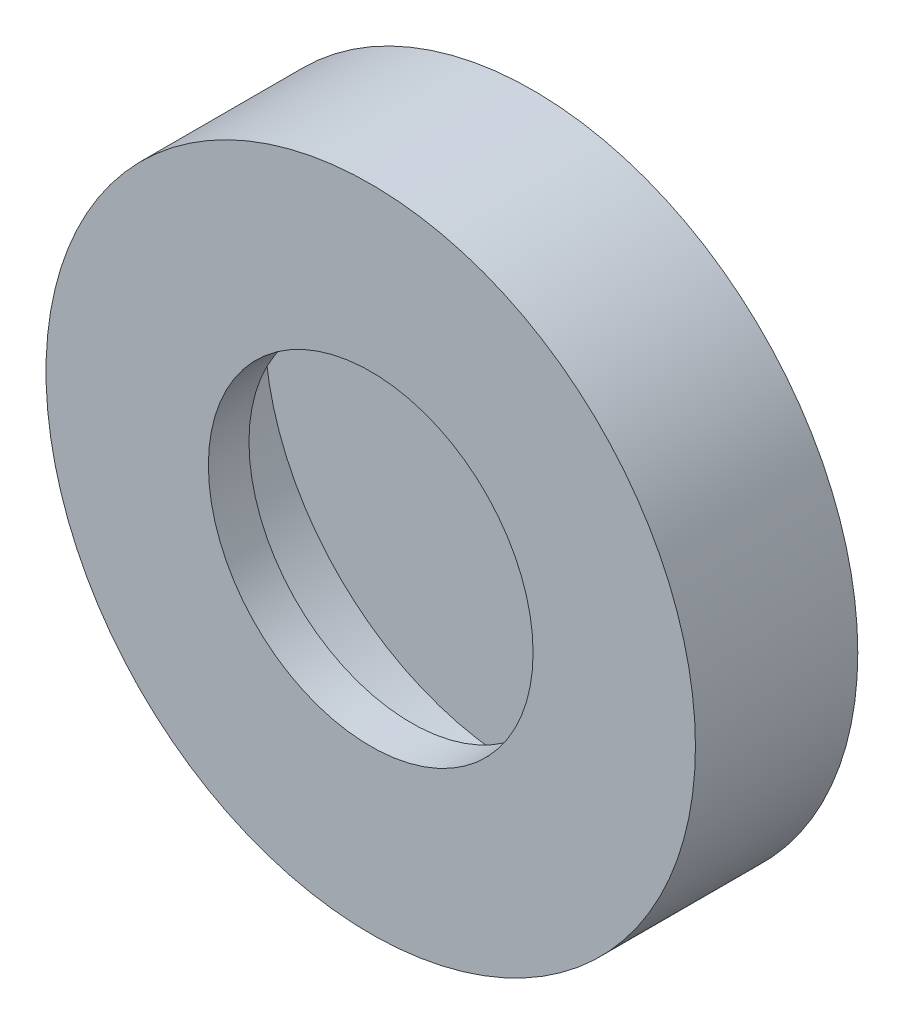
ISO-10303-21;
HEADER;
FILE_DESCRIPTION(('STEP AP214'),'2;1');
FILE_NAME('part.step','',(''),(''),'','','');
FILE_SCHEMA(('AUTOMOTIVE_DESIGN { 1 0 10303 214 1 1 1 1 }'));
ENDSEC;
DATA;
#1=APPLICATION_CONTEXT('core data for automotive mechanical design processes');
#2=APPLICATION_PROTOCOL_DEFINITION('international standard','automotive_design',2000,#1);
#3=PRODUCT_CONTEXT('',#1,'mechanical');
#4=PRODUCT('Part','Part','',(#3));
#5=PRODUCT_RELATED_PRODUCT_CATEGORY('part','',(#4));
#6=PRODUCT_DEFINITION_FORMATION('','',#4);
#7=PRODUCT_DEFINITION_CONTEXT('part definition',#1,'design');
#8=PRODUCT_DEFINITION('design','',#6,#7);
#9=PRODUCT_DEFINITION_SHAPE('','',#8);
#10=(LENGTH_UNIT() NAMED_UNIT(*) SI_UNIT(.MILLI.,.METRE.));
#11=(NAMED_UNIT(*) PLANE_ANGLE_UNIT() SI_UNIT($,.RADIAN.));
#12=(NAMED_UNIT(*) SI_UNIT($,.STERADIAN.) SOLID_ANGLE_UNIT());
#13=UNCERTAINTY_MEASURE_WITH_UNIT(LENGTH_MEASURE(1.E-05),#10,'distance_accuracy_value','');
#14=(GEOMETRIC_REPRESENTATION_CONTEXT(3) GLOBAL_UNCERTAINTY_ASSIGNED_CONTEXT((#13)) GLOBAL_UNIT_ASSIGNED_CONTEXT((#10,
#11,#12)) REPRESENTATION_CONTEXT('',''));
#15=CARTESIAN_POINT('',(0.,0.,0.));
#16=DIRECTION('',(0.,0.,1.));
#17=DIRECTION('',(1.,0.,0.));
#18=AXIS2_PLACEMENT_3D('',#15,#16,#17);
#19=CARTESIAN_POINT('',(0.,0.,25.4));
#20=DIRECTION('',(0.,0.,-1.));
#21=DIRECTION('',(-1.,0.,0.));
#22=AXIS2_PLACEMENT_3D('',#19,#20,#21);
#23=CYLINDRICAL_SURFACE('',#22,50.8);
#24=CARTESIAN_POINT('',(0.,0.,25.4));
#25=DIRECTION('',(0.,0.,1.));
#26=DIRECTION('',(1.,0.,0.));
#27=AXIS2_PLACEMENT_3D('',#24,#25,#26);
#28=CIRCLE('',#27,50.8);
#29=CARTESIAN_POINT('',(50.8,0.,25.4));
#30=VERTEX_POINT('',#29);
#31=EDGE_CURVE('E10',#30,#30,#28,.T.);
#32=ORIENTED_EDGE('',*,*,#31,.F.);
#33=EDGE_LOOP('',(#32));
#34=FACE_BOUND('',#33,.T.);
#35=CARTESIAN_POINT('',(0.,0.,0.));
#36=DIRECTION('',(0.,0.,1.));
#37=DIRECTION('',(1.,0.,0.));
#38=AXIS2_PLACEMENT_3D('',#35,#36,#37);
#39=CIRCLE('',#38,50.8);
#40=CARTESIAN_POINT('',(50.8,0.,0.));
#41=VERTEX_POINT('',#40);
#42=EDGE_CURVE('E40',#41,#41,#39,.T.);
#43=ORIENTED_EDGE('',*,*,#42,.T.);
#44=EDGE_LOOP('',(#43));
#45=FACE_BOUND('',#44,.T.);
#46=ADVANCED_FACE('F37',(#34,#45),#23,.T.);
#47=CARTESIAN_POINT('',(0.,0.,25.4));
#48=DIRECTION('',(0.,0.,1.));
#49=DIRECTION('',(1.,0.,0.));
#50=AXIS2_PLACEMENT_3D('',#47,#48,#49);
#51=PLANE('',#50);
#52=CARTESIAN_POINT('',(0.,0.,25.4));
#53=DIRECTION('',(0.,0.,1.));
#54=DIRECTION('',(1.,0.,0.));
#55=AXIS2_PLACEMENT_3D('',#52,#53,#54);
#56=CIRCLE('',#55,25.4);
#57=CARTESIAN_POINT('',(25.4,0.,25.4));
#58=VERTEX_POINT('',#57);
#59=EDGE_CURVE('E49',#58,#58,#56,.T.);
#60=ORIENTED_EDGE('',*,*,#59,.F.);
#61=EDGE_LOOP('',(#60));
#62=FACE_BOUND('',#61,.T.);
#63=ORIENTED_EDGE('',*,*,#31,.T.);
#64=EDGE_LOOP('',(#63));
#65=FACE_BOUND('',#64,.T.);
#66=ADVANCED_FACE('F85',(#62,#65),#51,.T.);
#67=CARTESIAN_POINT('',(0.,0.,0.));
#68=DIRECTION('',(0.,0.,1.));
#69=DIRECTION('',(1.,0.,0.));
#70=AXIS2_PLACEMENT_3D('',#67,#68,#69);
#71=PLANE('',#70);
#72=ORIENTED_EDGE('',*,*,#42,.F.);
#73=EDGE_LOOP('',(#72));
#74=FACE_BOUND('',#73,.T.);
#75=ADVANCED_FACE('F90',(#74),#71,.F.);
#76=CARTESIAN_POINT('',(0.,0.,19.05));
#77=DIRECTION('',(0.,0.,1.));
#78=DIRECTION('',(1.,0.,0.));
#79=AXIS2_PLACEMENT_3D('',#76,#77,#78);
#80=CYLINDRICAL_SURFACE('',#79,25.4);
#81=CARTESIAN_POINT('',(0.,0.,19.05));
#82=DIRECTION('',(0.,0.,1.));
#83=DIRECTION('',(1.,0.,0.));
#84=AXIS2_PLACEMENT_3D('',#81,#82,#83);
#85=CIRCLE('',#84,25.4);
#86=CARTESIAN_POINT('',(25.4,0.,19.05));
#87=VERTEX_POINT('',#86);
#88=EDGE_CURVE('E54',#87,#87,#85,.T.);
#89=ORIENTED_EDGE('',*,*,#88,.F.);
#90=EDGE_LOOP('',(#89));
#91=FACE_BOUND('',#90,.T.);
#92=ORIENTED_EDGE('',*,*,#59,.T.);
#93=EDGE_LOOP('',(#92));
#94=FACE_BOUND('',#93,.T.);
#95=ADVANCED_FACE('F72',(#91,#94),#80,.F.);
#96=CARTESIAN_POINT('',(0.,0.,2.));
#97=DIRECTION('',(0.,0.,1.));
#98=DIRECTION('',(1.,0.,0.));
#99=AXIS2_PLACEMENT_3D('',#96,#97,#98);
#100=CYLINDRICAL_SURFACE('',#99,40.);
#101=CARTESIAN_POINT('',(0.,0.,2.));
#102=DIRECTION('',(0.,0.,1.));
#103=DIRECTION('',(1.,0.,0.));
#104=AXIS2_PLACEMENT_3D('',#101,#102,#103);
#105=CIRCLE('',#104,40.);
#106=CARTESIAN_POINT('',(40.,0.,2.));
#107=VERTEX_POINT('',#106);
#108=EDGE_CURVE('E58',#107,#107,#105,.T.);
#109=ORIENTED_EDGE('',*,*,#108,.F.);
#110=EDGE_LOOP('',(#109));
#111=FACE_BOUND('',#110,.T.);
#112=CARTESIAN_POINT('',(0.,0.,19.05));
#113=DIRECTION('',(0.,0.,1.));
#114=DIRECTION('',(1.,0.,0.));
#115=AXIS2_PLACEMENT_3D('',#112,#113,#114);
#116=CIRCLE('',#115,40.);
#117=CARTESIAN_POINT('',(40.,0.,19.05));
#118=VERTEX_POINT('',#117);
#119=EDGE_CURVE('E59',#118,#118,#116,.T.);
#120=ORIENTED_EDGE('',*,*,#119,.T.);
#121=EDGE_LOOP('',(#120));
#122=FACE_BOUND('',#121,.T.);
#123=ADVANCED_FACE('F69',(#111,#122),#100,.F.);
#124=CARTESIAN_POINT('',(0.,0.,2.));
#125=DIRECTION('',(0.,0.,1.));
#126=DIRECTION('',(1.,0.,0.));
#127=AXIS2_PLACEMENT_3D('',#124,#125,#126);
#128=PLANE('',#127);
#129=ORIENTED_EDGE('',*,*,#108,.T.);
#130=EDGE_LOOP('',(#129));
#131=FACE_BOUND('',#130,.T.);
#132=ADVANCED_FACE('F67',(#131),#128,.T.);
#133=CARTESIAN_POINT('',(0.,0.,19.05));
#134=DIRECTION('',(0.,0.,1.));
#135=DIRECTION('',(1.,0.,0.));
#136=AXIS2_PLACEMENT_3D('',#133,#134,#135);
#137=PLANE('',#136);
#138=ORIENTED_EDGE('',*,*,#88,.T.);
#139=EDGE_LOOP('',(#138));
#140=FACE_BOUND('',#139,.T.);
#141=ORIENTED_EDGE('',*,*,#119,.F.);
#142=EDGE_LOOP('',(#141));
#143=FACE_BOUND('',#142,.T.);
#144=ADVANCED_FACE('F76',(#140,#143),#137,.F.);
#145=CLOSED_SHELL('',(#46,#66,#75,#95,#123,#132,#144));
#146=MANIFOLD_SOLID_BREP('B2',#145);
#147=ADVANCED_BREP_SHAPE_REPRESENTATION('',(#18,#146),#14);
#148=SHAPE_DEFINITION_REPRESENTATION(#9,#147);
ENDSEC;
END-ISO-10303-21;
